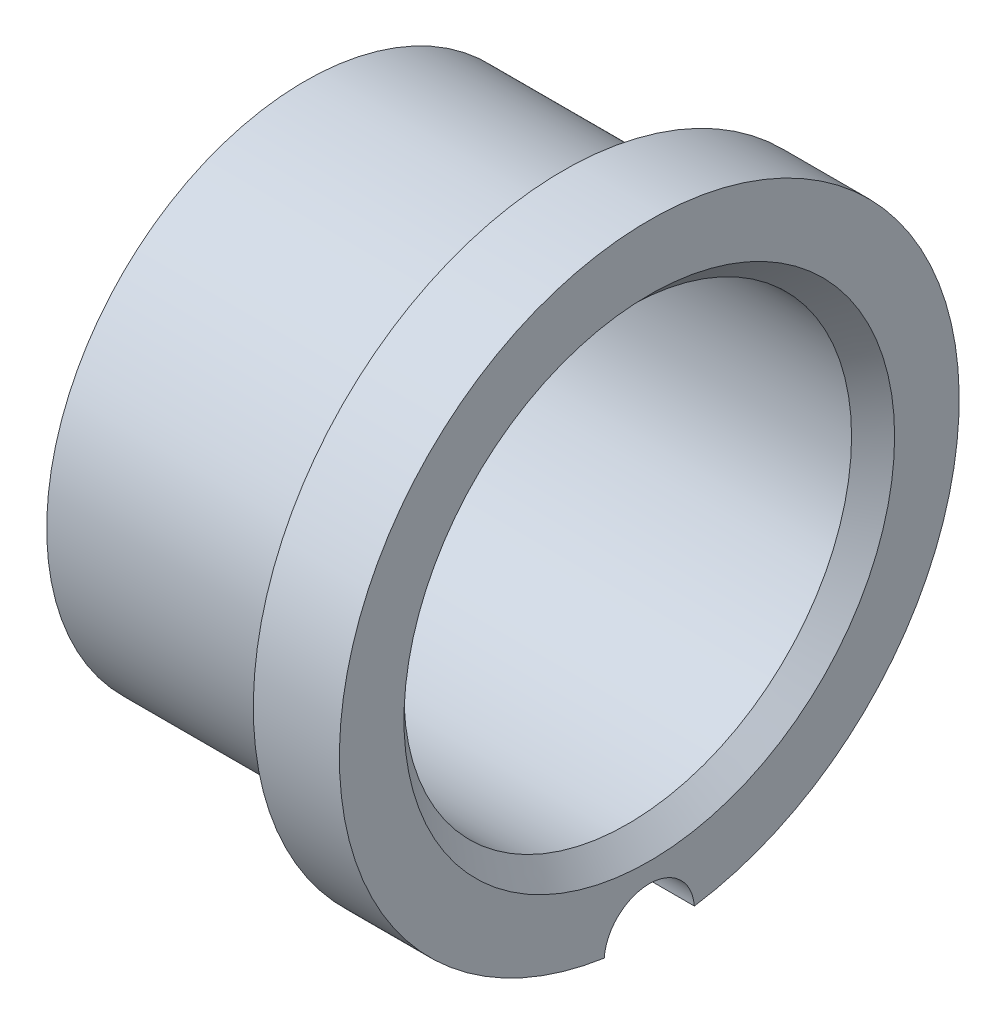
ISO-10303-21;
HEADER;
FILE_DESCRIPTION(('STEP AP214'),'2;1');
FILE_NAME('part.step','',(''),(''),'','','');
FILE_SCHEMA(('AUTOMOTIVE_DESIGN { 1 0 10303 214 1 1 1 1 }'));
ENDSEC;
DATA;
#1=APPLICATION_CONTEXT('core data for automotive mechanical design processes');
#2=APPLICATION_PROTOCOL_DEFINITION('international standard','automotive_design',2000,#1);
#3=PRODUCT_CONTEXT('',#1,'mechanical');
#4=PRODUCT('Part','Part','',(#3));
#5=PRODUCT_RELATED_PRODUCT_CATEGORY('part','',(#4));
#6=PRODUCT_DEFINITION_FORMATION('','',#4);
#7=PRODUCT_DEFINITION_CONTEXT('part definition',#1,'design');
#8=PRODUCT_DEFINITION('design','',#6,#7);
#9=PRODUCT_DEFINITION_SHAPE('','',#8);
#10=(LENGTH_UNIT() NAMED_UNIT(*) SI_UNIT(.MILLI.,.METRE.));
#11=(NAMED_UNIT(*) PLANE_ANGLE_UNIT() SI_UNIT($,.RADIAN.));
#12=(NAMED_UNIT(*) SI_UNIT($,.STERADIAN.) SOLID_ANGLE_UNIT());
#13=UNCERTAINTY_MEASURE_WITH_UNIT(LENGTH_MEASURE(1.E-05),#10,'distance_accuracy_value','');
#14=(GEOMETRIC_REPRESENTATION_CONTEXT(3) GLOBAL_UNCERTAINTY_ASSIGNED_CONTEXT((#13)) GLOBAL_UNIT_ASSIGNED_CONTEXT((#10,
#11,#12)) REPRESENTATION_CONTEXT('',''));
#15=CARTESIAN_POINT('',(0.,0.,0.));
#16=DIRECTION('',(0.,0.,1.));
#17=DIRECTION('',(1.,0.,0.));
#18=AXIS2_PLACEMENT_3D('',#15,#16,#17);
#19=CARTESIAN_POINT('',(30.,0.,0.));
#20=DIRECTION('',(-1.,0.,0.));
#21=DIRECTION('',(0.,0.,1.));
#22=AXIS2_PLACEMENT_3D('',#19,#20,#21);
#23=CYLINDRICAL_SURFACE('',#22,30.);
#24=CARTESIAN_POINT('',(30.,0.,0.));
#25=DIRECTION('',(1.,0.,0.));
#26=DIRECTION('',(0.,0.,-1.));
#27=AXIS2_PLACEMENT_3D('',#24,#25,#26);
#28=CIRCLE('',#27,30.);
#29=CARTESIAN_POINT('',(30.,0.,-30.));
#30=VERTEX_POINT('',#29);
#31=EDGE_CURVE('E96',#30,#30,#28,.T.);
#32=ORIENTED_EDGE('',*,*,#31,.F.);
#33=EDGE_LOOP('',(#32));
#34=FACE_BOUND('',#33,.T.);
#35=CARTESIAN_POINT('',(0.,0.,0.));
#36=DIRECTION('',(1.,0.,0.));
#37=DIRECTION('',(0.,0.,-1.));
#38=AXIS2_PLACEMENT_3D('',#35,#36,#37);
#39=CIRCLE('',#38,30.);
#40=CARTESIAN_POINT('',(0.,0.,-30.));
#41=VERTEX_POINT('',#40);
#42=EDGE_CURVE('E90',#41,#41,#39,.T.);
#43=ORIENTED_EDGE('',*,*,#42,.T.);
#44=EDGE_LOOP('',(#43));
#45=FACE_BOUND('',#44,.T.);
#46=ADVANCED_FACE('F47',(#34,#45),#23,.T.);
#47=CARTESIAN_POINT('',(0.,0.,0.));
#48=DIRECTION('',(1.,0.,0.));
#49=DIRECTION('',(0.,0.,-1.));
#50=AXIS2_PLACEMENT_3D('',#47,#48,#49);
#51=PLANE('',#50);
#52=CARTESIAN_POINT('',(0.,0.,0.));
#53=DIRECTION('',(1.,0.,0.));
#54=DIRECTION('',(0.,0.,-1.));
#55=AXIS2_PLACEMENT_3D('',#52,#53,#54);
#56=CIRCLE('',#55,26.);
#57=CARTESIAN_POINT('',(0.,0.,-26.));
#58=VERTEX_POINT('',#57);
#59=EDGE_CURVE('E98',#58,#58,#56,.T.);
#60=ORIENTED_EDGE('',*,*,#59,.T.);
#61=EDGE_LOOP('',(#60));
#62=FACE_BOUND('',#61,.T.);
#63=ORIENTED_EDGE('',*,*,#42,.F.);
#64=EDGE_LOOP('',(#63));
#65=FACE_BOUND('',#64,.T.);
#66=ADVANCED_FACE('F127',(#62,#65),#51,.F.);
#67=CARTESIAN_POINT('',(40.,0.,0.));
#68=DIRECTION('',(-1.,0.,0.));
#69=DIRECTION('',(0.,0.,1.));
#70=AXIS2_PLACEMENT_3D('',#67,#68,#69);
#71=CYLINDRICAL_SURFACE('',#70,36.);
#72=CARTESIAN_POINT('',(30.,0.,0.));
#73=DIRECTION('',(1.,0.,0.));
#74=DIRECTION('',(0.,0.,-1.));
#75=AXIS2_PLACEMENT_3D('',#72,#73,#74);
#76=CIRCLE('',#75,36.);
#77=CARTESIAN_POINT('',(30.,-35.6171875,-5.23602469339518));
#78=VERTEX_POINT('',#77);
#79=CARTESIAN_POINT('',(30.,-35.6171875,5.23602469339517));
#80=VERTEX_POINT('',#79);
#81=EDGE_CURVE('E91',#78,#80,#76,.T.);
#82=ORIENTED_EDGE('',*,*,#81,.T.);
#83=DIRECTION('',(1.,0.,0.));
#84=VECTOR('',#83,1.);
#85=CARTESIAN_POINT('',(30.,-35.6171875,5.23602469339514));
#86=LINE('',#85,#84);
#87=CARTESIAN_POINT('',(40.,-35.6171875,5.23602469339514));
#88=VERTEX_POINT('',#87);
#89=EDGE_CURVE('E64',#80,#88,#86,.T.);
#90=ORIENTED_EDGE('',*,*,#89,.T.);
#91=CARTESIAN_POINT('',(40.,0.,0.));
#92=DIRECTION('',(1.,0.,0.));
#93=DIRECTION('',(0.,0.,-1.));
#94=AXIS2_PLACEMENT_3D('',#91,#92,#93);
#95=CIRCLE('',#94,36.);
#96=CARTESIAN_POINT('',(40.,-35.6171875,-5.23602469339515));
#97=VERTEX_POINT('',#96);
#98=EDGE_CURVE('E85',#97,#88,#95,.T.);
#99=ORIENTED_EDGE('',*,*,#98,.F.);
#100=DIRECTION('',(1.,0.,0.));
#101=VECTOR('',#100,1.);
#102=CARTESIAN_POINT('',(30.,-35.6171875,-5.23602469339515));
#103=LINE('',#102,#101);
#104=EDGE_CURVE('E71',#97,#78,#103,.F.);
#105=ORIENTED_EDGE('',*,*,#104,.T.);
#106=EDGE_LOOP('',(#82,#90,#99,#105));
#107=FACE_BOUND('',#106,.T.);
#108=ADVANCED_FACE('F88',(#107),#71,.T.);
#109=CARTESIAN_POINT('',(40.,0.,0.));
#110=DIRECTION('',(1.,0.,0.));
#111=DIRECTION('',(0.,0.,-1.));
#112=AXIS2_PLACEMENT_3D('',#109,#110,#111);
#113=PLANE('',#112);
#114=CARTESIAN_POINT('',(40.,-36.,0.));
#115=DIRECTION('',(1.,0.,0.));
#116=DIRECTION('',(0.,0.,-1.));
#117=AXIS2_PLACEMENT_3D('',#114,#115,#116);
#118=CIRCLE('',#117,5.25);
#119=EDGE_CURVE('E74',#97,#88,#118,.T.);
#120=ORIENTED_EDGE('',*,*,#119,.F.);
#121=ORIENTED_EDGE('',*,*,#98,.T.);
#122=EDGE_LOOP('',(#120,#121));
#123=FACE_BOUND('',#122,.T.);
#124=CARTESIAN_POINT('',(40.,0.,0.));
#125=DIRECTION('',(1.,0.,0.));
#126=DIRECTION('',(0.,0.,-1.));
#127=AXIS2_PLACEMENT_3D('',#124,#125,#126);
#128=CIRCLE('',#127,28.5);
#129=CARTESIAN_POINT('',(40.,0.,-28.5));
#130=VERTEX_POINT('',#129);
#131=EDGE_CURVE('E57',#130,#130,#128,.F.);
#132=ORIENTED_EDGE('',*,*,#131,.T.);
#133=EDGE_LOOP('',(#132));
#134=FACE_BOUND('',#133,.T.);
#135=ADVANCED_FACE('F83',(#123,#134),#113,.T.);
#136=CARTESIAN_POINT('',(30.,0.,0.));
#137=DIRECTION('',(1.,0.,0.));
#138=DIRECTION('',(0.,0.,-1.));
#139=AXIS2_PLACEMENT_3D('',#136,#137,#138);
#140=PLANE('',#139);
#141=ORIENTED_EDGE('',*,*,#31,.T.);
#142=EDGE_LOOP('',(#141));
#143=FACE_BOUND('',#142,.T.);
#144=ORIENTED_EDGE('',*,*,#81,.F.);
#145=CARTESIAN_POINT('',(30.,-36.,0.));
#146=DIRECTION('',(1.,0.,0.));
#147=DIRECTION('',(0.,0.,-1.));
#148=AXIS2_PLACEMENT_3D('',#145,#146,#147);
#149=CIRCLE('',#148,5.25);
#150=EDGE_CURVE('E11',#78,#80,#149,.T.);
#151=ORIENTED_EDGE('',*,*,#150,.T.);
#152=EDGE_LOOP('',(#144,#151));
#153=FACE_BOUND('',#152,.T.);
#154=ADVANCED_FACE('F120',(#143,#153),#140,.F.);
#155=CARTESIAN_POINT('',(0.,0.,0.));
#156=DIRECTION('',(1.,0.,0.));
#157=DIRECTION('',(0.,0.,-1.));
#158=AXIS2_PLACEMENT_3D('',#155,#156,#157);
#159=CYLINDRICAL_SURFACE('',#158,26.);
#160=CARTESIAN_POINT('',(37.5,0.,0.));
#161=DIRECTION('',(1.,0.,0.));
#162=DIRECTION('',(0.,0.,-1.));
#163=AXIS2_PLACEMENT_3D('',#160,#161,#162);
#164=CIRCLE('',#163,26.);
#165=CARTESIAN_POINT('',(37.5,0.,-26.));
#166=VERTEX_POINT('',#165);
#167=EDGE_CURVE('E105',#166,#166,#164,.T.);
#168=ORIENTED_EDGE('',*,*,#167,.T.);
#169=EDGE_LOOP('',(#168));
#170=FACE_BOUND('',#169,.T.);
#171=ORIENTED_EDGE('',*,*,#59,.F.);
#172=EDGE_LOOP('',(#171));
#173=FACE_BOUND('',#172,.T.);
#174=ADVANCED_FACE('F115',(#170,#173),#159,.F.);
#175=CARTESIAN_POINT('',(37.5,0.,0.));
#176=DIRECTION('',(1.,0.,0.));
#177=DIRECTION('',(0.,0.,-1.));
#178=AXIS2_PLACEMENT_3D('',#175,#176,#177);
#179=CONICAL_SURFACE('',#178,26.,0.785398163397445);
#180=ORIENTED_EDGE('',*,*,#131,.F.);
#181=EDGE_LOOP('',(#180));
#182=FACE_BOUND('',#181,.T.);
#183=ORIENTED_EDGE('',*,*,#167,.F.);
#184=EDGE_LOOP('',(#183));
#185=FACE_BOUND('',#184,.T.);
#186=ADVANCED_FACE('F50',(#182,#185),#179,.F.);
#187=CARTESIAN_POINT('',(40.,-36.,0.));
#188=DIRECTION('',(1.,0.,0.));
#189=DIRECTION('',(0.,0.,-1.));
#190=AXIS2_PLACEMENT_3D('',#187,#188,#189);
#191=CYLINDRICAL_SURFACE('',#190,5.25);
#192=ORIENTED_EDGE('',*,*,#150,.F.);
#193=ORIENTED_EDGE('',*,*,#104,.F.);
#194=ORIENTED_EDGE('',*,*,#119,.T.);
#195=ORIENTED_EDGE('',*,*,#89,.F.);
#196=EDGE_LOOP('',(#192,#193,#194,#195));
#197=FACE_BOUND('',#196,.T.);
#198=ADVANCED_FACE('F73',(#197),#191,.F.);
#199=CLOSED_SHELL('',(#46,#66,#108,#135,#154,#174,#186,#198));
#200=MANIFOLD_SOLID_BREP('B2',#199);
#201=ADVANCED_BREP_SHAPE_REPRESENTATION('',(#18,#200),#14);
#202=SHAPE_DEFINITION_REPRESENTATION(#9,#201);
ENDSEC;
END-ISO-10303-21;
